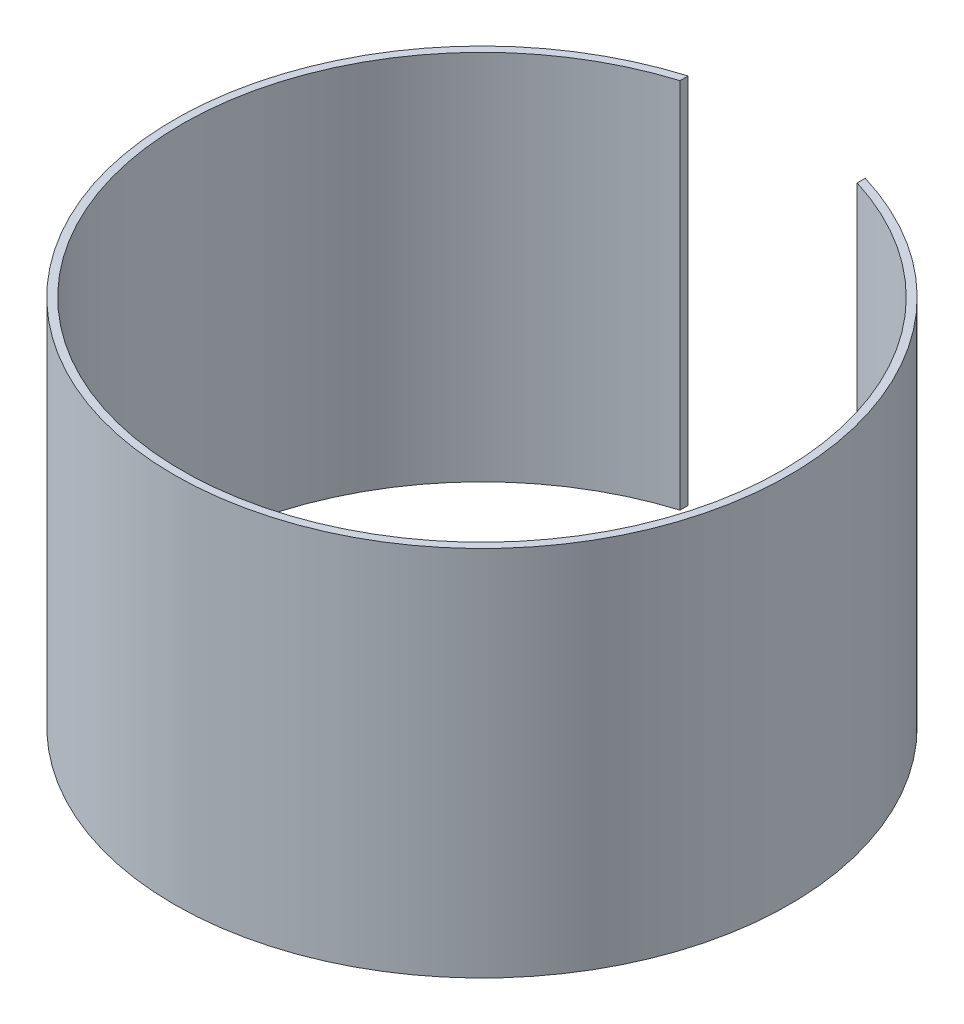
ISO-10303-21;
HEADER;
FILE_DESCRIPTION(('STEP AP214'),'2;1');
FILE_NAME('part.step','',(''),(''),'','','');
FILE_SCHEMA(('AUTOMOTIVE_DESIGN { 1 0 10303 214 1 1 1 1 }'));
ENDSEC;
DATA;
#1=APPLICATION_CONTEXT('core data for automotive mechanical design processes');
#2=APPLICATION_PROTOCOL_DEFINITION('international standard','automotive_design',2000,#1);
#3=PRODUCT_CONTEXT('',#1,'mechanical');
#4=PRODUCT('Part','Part','',(#3));
#5=PRODUCT_RELATED_PRODUCT_CATEGORY('part','',(#4));
#6=PRODUCT_DEFINITION_FORMATION('','',#4);
#7=PRODUCT_DEFINITION_CONTEXT('part definition',#1,'design');
#8=PRODUCT_DEFINITION('design','',#6,#7);
#9=PRODUCT_DEFINITION_SHAPE('','',#8);
#10=(LENGTH_UNIT() NAMED_UNIT(*) SI_UNIT(.MILLI.,.METRE.));
#11=(NAMED_UNIT(*) PLANE_ANGLE_UNIT() SI_UNIT($,.RADIAN.));
#12=(NAMED_UNIT(*) SI_UNIT($,.STERADIAN.) SOLID_ANGLE_UNIT());
#13=UNCERTAINTY_MEASURE_WITH_UNIT(LENGTH_MEASURE(1.E-05),#10,'distance_accuracy_value','');
#14=(GEOMETRIC_REPRESENTATION_CONTEXT(3) GLOBAL_UNCERTAINTY_ASSIGNED_CONTEXT((#13)) GLOBAL_UNIT_ASSIGNED_CONTEXT((#10,
#11,#12)) REPRESENTATION_CONTEXT('',''));
#15=CARTESIAN_POINT('',(0.,0.,0.));
#16=DIRECTION('',(0.,0.,1.));
#17=DIRECTION('',(1.,0.,0.));
#18=AXIS2_PLACEMENT_3D('',#15,#16,#17);
#19=CARTESIAN_POINT('',(-29.4154884988022,49.,-2.32651714191494));
#20=DIRECTION('',(0.,1.,0.));
#21=DIRECTION('',(0.,0.,1.));
#22=AXIS2_PLACEMENT_3D('',#19,#20,#21);
#23=PLANE('',#22);
#24=DIRECTION('',(0.,0.,1.));
#25=VECTOR('',#24,1.);
#26=CARTESIAN_POINT('',(-41.0814884988022,49.,-48.));
#27=LINE('',#26,#25);
#28=CARTESIAN_POINT('',(-41.0814884988022,49.,-41.1496273728071));
#29=VERTEX_POINT('',#28);
#30=CARTESIAN_POINT('',(-41.0814884988022,49.,-40.0875145863681));
#31=VERTEX_POINT('',#30);
#32=EDGE_CURVE('E54',#29,#31,#27,.T.);
#33=ORIENTED_EDGE('',*,*,#32,.F.);
#34=CARTESIAN_POINT('',(-29.4154884988022,49.,-2.32651714191494));
#35=DIRECTION('',(0.,1.,0.));
#36=DIRECTION('',(0.,0.,1.));
#37=AXIS2_PLACEMENT_3D('',#34,#35,#36);
#38=CIRCLE('',#37,40.538);
#39=CARTESIAN_POINT('',(-17.7494884988022,49.,-41.1496273728071));
#40=VERTEX_POINT('',#39);
#41=EDGE_CURVE('E91',#29,#40,#38,.T.);
#42=ORIENTED_EDGE('',*,*,#41,.T.);
#43=DIRECTION('',(0.,0.,1.));
#44=VECTOR('',#43,1.);
#45=CARTESIAN_POINT('',(-17.7494884988022,49.,-48.));
#46=LINE('',#45,#44);
#47=CARTESIAN_POINT('',(-17.7494884988022,49.,-40.0875145863681));
#48=VERTEX_POINT('',#47);
#49=EDGE_CURVE('E73',#40,#48,#46,.T.);
#50=ORIENTED_EDGE('',*,*,#49,.T.);
#51=CARTESIAN_POINT('',(-29.4154884988022,49.,-2.32651714191494));
#52=DIRECTION('',(0.,1.,0.));
#53=DIRECTION('',(0.,0.,1.));
#54=AXIS2_PLACEMENT_3D('',#51,#52,#53);
#55=CIRCLE('',#54,39.522);
#56=EDGE_CURVE('E92',#31,#48,#55,.T.);
#57=ORIENTED_EDGE('',*,*,#56,.F.);
#58=EDGE_LOOP('',(#33,#42,#50,#57));
#59=FACE_BOUND('',#58,.T.);
#60=ADVANCED_FACE('F32',(#59),#23,.T.);
#61=CARTESIAN_POINT('',(-29.4154884988022,0.,-2.32651714191494));
#62=DIRECTION('',(0.,1.,0.));
#63=DIRECTION('',(0.,0.,1.));
#64=AXIS2_PLACEMENT_3D('',#61,#62,#63);
#65=PLANE('',#64);
#66=CARTESIAN_POINT('',(-29.4154884988022,0.,-2.32651714191494));
#67=DIRECTION('',(0.,1.,0.));
#68=DIRECTION('',(0.,0.,1.));
#69=AXIS2_PLACEMENT_3D('',#66,#67,#68);
#70=CIRCLE('',#69,40.538);
#71=CARTESIAN_POINT('',(-41.0814884988022,0.,-41.1496273728071));
#72=VERTEX_POINT('',#71);
#73=CARTESIAN_POINT('',(-17.7494884988022,0.,-41.1496273728071));
#74=VERTEX_POINT('',#73);
#75=EDGE_CURVE('E85',#72,#74,#70,.T.);
#76=ORIENTED_EDGE('',*,*,#75,.F.);
#77=DIRECTION('',(0.,0.,1.));
#78=VECTOR('',#77,1.);
#79=CARTESIAN_POINT('',(-41.0814884988022,0.,-48.));
#80=LINE('',#79,#78);
#81=CARTESIAN_POINT('',(-41.0814884988022,0.,-40.0875145863681));
#82=VERTEX_POINT('',#81);
#83=EDGE_CURVE('E88',#72,#82,#80,.T.);
#84=ORIENTED_EDGE('',*,*,#83,.T.);
#85=CARTESIAN_POINT('',(-29.4154884988022,0.,-2.32651714191494));
#86=DIRECTION('',(0.,1.,0.));
#87=DIRECTION('',(0.,0.,1.));
#88=AXIS2_PLACEMENT_3D('',#85,#86,#87);
#89=CIRCLE('',#88,39.522);
#90=CARTESIAN_POINT('',(-17.7494884988022,0.,-40.0875145863681));
#91=VERTEX_POINT('',#90);
#92=EDGE_CURVE('E87',#82,#91,#89,.T.);
#93=ORIENTED_EDGE('',*,*,#92,.T.);
#94=DIRECTION('',(0.,0.,1.));
#95=VECTOR('',#94,1.);
#96=CARTESIAN_POINT('',(-17.7494884988022,0.,-48.));
#97=LINE('',#96,#95);
#98=EDGE_CURVE('E47',#74,#91,#97,.T.);
#99=ORIENTED_EDGE('',*,*,#98,.F.);
#100=EDGE_LOOP('',(#76,#84,#93,#99));
#101=FACE_BOUND('',#100,.T.);
#102=ADVANCED_FACE('F83',(#101),#65,.F.);
#103=CARTESIAN_POINT('',(-29.4154884988022,49.,-2.32651714191494));
#104=DIRECTION('',(0.,-1.,0.));
#105=DIRECTION('',(0.,0.,-1.));
#106=AXIS2_PLACEMENT_3D('',#103,#104,#105);
#107=CYLINDRICAL_SURFACE('',#106,40.538);
#108=ORIENTED_EDGE('',*,*,#41,.F.);
#109=DIRECTION('',(0.,-1.,0.));
#110=VECTOR('',#109,1.);
#111=CARTESIAN_POINT('',(-41.0814884988022,49.,-41.1496273728071));
#112=LINE('',#111,#110);
#113=EDGE_CURVE('E78',#29,#72,#112,.T.);
#114=ORIENTED_EDGE('',*,*,#113,.T.);
#115=ORIENTED_EDGE('',*,*,#75,.T.);
#116=DIRECTION('',(0.,-1.,0.));
#117=VECTOR('',#116,1.);
#118=CARTESIAN_POINT('',(-17.7494884988022,49.,-41.1496273728071));
#119=LINE('',#118,#117);
#120=EDGE_CURVE('E70',#74,#40,#119,.F.);
#121=ORIENTED_EDGE('',*,*,#120,.T.);
#122=EDGE_LOOP('',(#108,#114,#115,#121));
#123=FACE_BOUND('',#122,.T.);
#124=ADVANCED_FACE('F34',(#123),#107,.T.);
#125=CARTESIAN_POINT('',(-29.4154884988022,49.,-2.32651714191494));
#126=DIRECTION('',(0.,-1.,0.));
#127=DIRECTION('',(0.,0.,-1.));
#128=AXIS2_PLACEMENT_3D('',#125,#126,#127);
#129=CYLINDRICAL_SURFACE('',#128,39.522);
#130=DIRECTION('',(0.,-1.,0.));
#131=VECTOR('',#130,1.);
#132=CARTESIAN_POINT('',(-41.0814884988022,49.,-40.0875145863681));
#133=LINE('',#132,#131);
#134=EDGE_CURVE('E11',#31,#82,#133,.T.);
#135=ORIENTED_EDGE('',*,*,#134,.F.);
#136=ORIENTED_EDGE('',*,*,#56,.T.);
#137=DIRECTION('',(0.,-1.,0.));
#138=VECTOR('',#137,1.);
#139=CARTESIAN_POINT('',(-17.7494884988022,49.,-40.0875145863681));
#140=LINE('',#139,#138);
#141=EDGE_CURVE('E40',#91,#48,#140,.F.);
#142=ORIENTED_EDGE('',*,*,#141,.F.);
#143=ORIENTED_EDGE('',*,*,#92,.F.);
#144=EDGE_LOOP('',(#135,#136,#142,#143));
#145=FACE_BOUND('',#144,.T.);
#146=ADVANCED_FACE('F102',(#145),#129,.F.);
#147=CARTESIAN_POINT('',(-17.7494884988022,19.5,-48.));
#148=DIRECTION('',(1.,0.,0.));
#149=DIRECTION('',(0.,0.,-1.));
#150=AXIS2_PLACEMENT_3D('',#147,#148,#149);
#151=PLANE('',#150);
#152=ORIENTED_EDGE('',*,*,#98,.T.);
#153=ORIENTED_EDGE('',*,*,#141,.T.);
#154=ORIENTED_EDGE('',*,*,#49,.F.);
#155=ORIENTED_EDGE('',*,*,#120,.F.);
#156=EDGE_LOOP('',(#152,#153,#154,#155));
#157=FACE_BOUND('',#156,.T.);
#158=ADVANCED_FACE('F71',(#157),#151,.F.);
#159=CARTESIAN_POINT('',(-41.0814884988022,49.,-48.));
#160=DIRECTION('',(-1.,0.,0.));
#161=DIRECTION('',(0.,0.,1.));
#162=AXIS2_PLACEMENT_3D('',#159,#160,#161);
#163=PLANE('',#162);
#164=ORIENTED_EDGE('',*,*,#32,.T.);
#165=ORIENTED_EDGE('',*,*,#134,.T.);
#166=ORIENTED_EDGE('',*,*,#83,.F.);
#167=ORIENTED_EDGE('',*,*,#113,.F.);
#168=EDGE_LOOP('',(#164,#165,#166,#167));
#169=FACE_BOUND('',#168,.T.);
#170=ADVANCED_FACE('F103',(#169),#163,.F.);
#171=CLOSED_SHELL('',(#60,#102,#124,#146,#158,#170));
#172=MANIFOLD_SOLID_BREP('B2',#171);
#173=ADVANCED_BREP_SHAPE_REPRESENTATION('',(#18,#172),#14);
#174=SHAPE_DEFINITION_REPRESENTATION(#9,#173);
ENDSEC;
END-ISO-10303-21;
